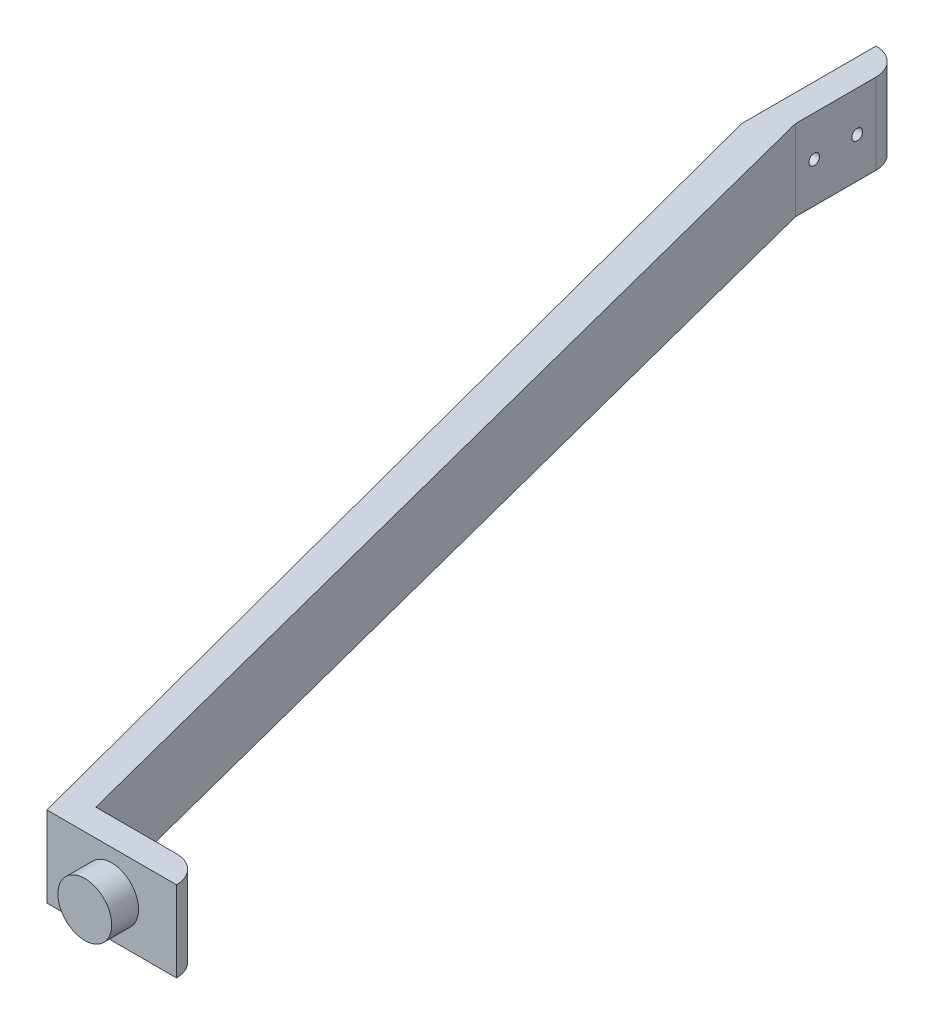
ISO-10303-21;
HEADER;
FILE_DESCRIPTION(('STEP AP214'),'2;1');
FILE_NAME('part.step','',(''),(''),'','','');
FILE_SCHEMA(('AUTOMOTIVE_DESIGN { 1 0 10303 214 1 1 1 1 }'));
ENDSEC;
DATA;
#1=APPLICATION_CONTEXT('core data for automotive mechanical design processes');
#2=APPLICATION_PROTOCOL_DEFINITION('international standard','automotive_design',2000,#1);
#3=PRODUCT_CONTEXT('',#1,'mechanical');
#4=PRODUCT('Part','Part','',(#3));
#5=PRODUCT_RELATED_PRODUCT_CATEGORY('part','',(#4));
#6=PRODUCT_DEFINITION_FORMATION('','',#4);
#7=PRODUCT_DEFINITION_CONTEXT('part definition',#1,'design');
#8=PRODUCT_DEFINITION('design','',#6,#7);
#9=PRODUCT_DEFINITION_SHAPE('','',#8);
#10=(LENGTH_UNIT() NAMED_UNIT(*) SI_UNIT(.MILLI.,.METRE.));
#11=(NAMED_UNIT(*) PLANE_ANGLE_UNIT() SI_UNIT($,.RADIAN.));
#12=(NAMED_UNIT(*) SI_UNIT($,.STERADIAN.) SOLID_ANGLE_UNIT());
#13=UNCERTAINTY_MEASURE_WITH_UNIT(LENGTH_MEASURE(1.E-05),#10,'distance_accuracy_value','');
#14=(GEOMETRIC_REPRESENTATION_CONTEXT(3) GLOBAL_UNCERTAINTY_ASSIGNED_CONTEXT((#13)) GLOBAL_UNIT_ASSIGNED_CONTEXT((#10,
#11,#12)) REPRESENTATION_CONTEXT('',''));
#15=CARTESIAN_POINT('',(0.,0.,0.));
#16=DIRECTION('',(0.,0.,1.));
#17=DIRECTION('',(1.,0.,0.));
#18=AXIS2_PLACEMENT_3D('',#15,#16,#17);
#19=CARTESIAN_POINT('',(70.,30.,200.));
#20=DIRECTION('',(0.,0.,-1.));
#21=DIRECTION('',(-1.,0.,0.));
#22=AXIS2_PLACEMENT_3D('',#19,#20,#21);
#23=PLANE('',#22);
#24=DIRECTION('',(0.,1.,0.));
#25=VECTOR('',#24,1.);
#26=CARTESIAN_POINT('',(21.7864152152697,0.,200.));
#27=LINE('',#26,#25);
#28=CARTESIAN_POINT('',(21.7864152152697,0.,200.));
#29=VERTEX_POINT('',#28);
#30=CARTESIAN_POINT('',(21.7864152152697,30.,200.));
#31=VERTEX_POINT('',#30);
#32=EDGE_CURVE('E168',#29,#31,#27,.T.);
#33=ORIENTED_EDGE('',*,*,#32,.F.);
#34=DIRECTION('',(1.,0.,0.));
#35=VECTOR('',#34,1.);
#36=CARTESIAN_POINT('',(70.,0.,200.));
#37=LINE('',#36,#35);
#38=CARTESIAN_POINT('',(70.,0.,200.));
#39=VERTEX_POINT('',#38);
#40=EDGE_CURVE('E177',#29,#39,#37,.T.);
#41=ORIENTED_EDGE('',*,*,#40,.T.);
#42=DIRECTION('',(0.,-1.,0.));
#43=VECTOR('',#42,1.);
#44=CARTESIAN_POINT('',(70.,30.,200.));
#45=LINE('',#44,#43);
#46=CARTESIAN_POINT('',(70.,30.,200.));
#47=VERTEX_POINT('',#46);
#48=EDGE_CURVE('E185',#47,#39,#45,.T.);
#49=ORIENTED_EDGE('',*,*,#48,.F.);
#50=DIRECTION('',(1.,0.,0.));
#51=VECTOR('',#50,1.);
#52=CARTESIAN_POINT('',(70.,30.,200.));
#53=LINE('',#52,#51);
#54=EDGE_CURVE('E176',#31,#47,#53,.T.);
#55=ORIENTED_EDGE('',*,*,#54,.F.);
#56=EDGE_LOOP('',(#33,#41,#49,#55));
#57=FACE_BOUND('',#56,.T.);
#58=CARTESIAN_POINT('',(45.8932076076348,15.,200.));
#59=DIRECTION('',(0.,0.,-1.));
#60=DIRECTION('',(-1.,0.,0.));
#61=AXIS2_PLACEMENT_3D('',#58,#59,#60);
#62=CIRCLE('',#61,10.);
#63=CARTESIAN_POINT('',(35.8932076076348,15.,200.));
#64=VERTEX_POINT('',#63);
#65=EDGE_CURVE('E188',#64,#64,#62,.F.);
#66=ORIENTED_EDGE('',*,*,#65,.F.);
#67=EDGE_LOOP('',(#66));
#68=FACE_BOUND('',#67,.T.);
#69=ADVANCED_FACE('F62',(#57,#68),#23,.F.);
#70=CARTESIAN_POINT('',(-70.,30.,-200.));
#71=DIRECTION('',(1.,0.,0.));
#72=DIRECTION('',(0.,0.,-1.));
#73=AXIS2_PLACEMENT_3D('',#70,#71,#72);
#74=PLANE('',#73);
#75=CARTESIAN_POINT('',(-70.,15.,-167.));
#76=DIRECTION('',(-1.,0.,0.));
#77=DIRECTION('',(0.,0.,1.));
#78=AXIS2_PLACEMENT_3D('',#75,#76,#77);
#79=CIRCLE('',#78,2.);
#80=CARTESIAN_POINT('',(-70.,15.,-165.));
#81=VERTEX_POINT('',#80);
#82=EDGE_CURVE('E195',#81,#81,#79,.T.);
#83=ORIENTED_EDGE('',*,*,#82,.F.);
#84=EDGE_LOOP('',(#83));
#85=FACE_BOUND('',#84,.T.);
#86=CARTESIAN_POINT('',(-70.,15.,-183.));
#87=DIRECTION('',(-1.,0.,0.));
#88=DIRECTION('',(0.,0.,1.));
#89=AXIS2_PLACEMENT_3D('',#86,#87,#88);
#90=CIRCLE('',#89,2.);
#91=CARTESIAN_POINT('',(-70.,15.,-181.));
#92=VERTEX_POINT('',#91);
#93=EDGE_CURVE('E191',#92,#92,#90,.T.);
#94=ORIENTED_EDGE('',*,*,#93,.F.);
#95=EDGE_LOOP('',(#94));
#96=FACE_BOUND('',#95,.T.);
#97=DIRECTION('',(0.,1.,0.));
#98=VECTOR('',#97,1.);
#99=CARTESIAN_POINT('',(-70.,0.,-150.));
#100=LINE('',#99,#98);
#101=CARTESIAN_POINT('',(-70.,0.,-150.));
#102=VERTEX_POINT('',#101);
#103=CARTESIAN_POINT('',(-70.,30.,-150.));
#104=VERTEX_POINT('',#103);
#105=EDGE_CURVE('E165',#102,#104,#100,.T.);
#106=ORIENTED_EDGE('',*,*,#105,.T.);
#107=DIRECTION('',(0.,0.,1.));
#108=VECTOR('',#107,1.);
#109=CARTESIAN_POINT('',(-70.,30.,-200.));
#110=LINE('',#109,#108);
#111=CARTESIAN_POINT('',(-70.,30.,-200.));
#112=VERTEX_POINT('',#111);
#113=EDGE_CURVE('E173',#112,#104,#110,.T.);
#114=ORIENTED_EDGE('',*,*,#113,.F.);
#115=DIRECTION('',(0.,-1.,0.));
#116=VECTOR('',#115,1.);
#117=CARTESIAN_POINT('',(-70.,30.,-200.));
#118=LINE('',#117,#116);
#119=CARTESIAN_POINT('',(-70.,0.,-200.));
#120=VERTEX_POINT('',#119);
#121=EDGE_CURVE('E179',#112,#120,#118,.T.);
#122=ORIENTED_EDGE('',*,*,#121,.T.);
#123=DIRECTION('',(0.,0.,1.));
#124=VECTOR('',#123,1.);
#125=CARTESIAN_POINT('',(-70.,0.,-200.));
#126=LINE('',#125,#124);
#127=EDGE_CURVE('E170',#120,#102,#126,.T.);
#128=ORIENTED_EDGE('',*,*,#127,.T.);
#129=EDGE_LOOP('',(#106,#114,#122,#128));
#130=FACE_BOUND('',#129,.T.);
#131=ADVANCED_FACE('F208',(#85,#96,#130),#74,.F.);
#132=CARTESIAN_POINT('',(0.,30.,0.));
#133=DIRECTION('',(0.,-1.,0.));
#134=DIRECTION('',(0.,0.,-1.));
#135=AXIS2_PLACEMENT_3D('',#132,#133,#134);
#136=PLANE('',#135);
#137=ORIENTED_EDGE('',*,*,#54,.T.);
#138=CARTESIAN_POINT('',(60.,30.,200.));
#139=DIRECTION('',(0.,-1.,0.));
#140=DIRECTION('',(0.,0.,-1.));
#141=AXIS2_PLACEMENT_3D('',#138,#139,#140);
#142=CIRCLE('',#141,10.);
#143=CARTESIAN_POINT('',(60.,30.,190.));
#144=VERTEX_POINT('',#143);
#145=EDGE_CURVE('E84',#47,#144,#142,.F.);
#146=ORIENTED_EDGE('',*,*,#145,.T.);
#147=DIRECTION('',(-1.,0.,0.));
#148=VECTOR('',#147,1.);
#149=CARTESIAN_POINT('',(0.,30.,190.));
#150=LINE('',#149,#148);
#151=CARTESIAN_POINT('',(30.,30.,190.));
#152=VERTEX_POINT('',#151);
#153=EDGE_CURVE('E136',#144,#152,#150,.T.);
#154=ORIENTED_EDGE('',*,*,#153,.T.);
#155=DIRECTION('',(0.249041039810619,0.,0.96849293259685));
#156=VECTOR('',#155,1.);
#157=CARTESIAN_POINT('',(-17.687595712098,30.,4.54823889739664));
#158=LINE('',#157,#156);
#159=CARTESIAN_POINT('',(-60.,30.,-160.));
#160=VERTEX_POINT('',#159);
#161=EDGE_CURVE('E157',#160,#152,#158,.T.);
#162=ORIENTED_EDGE('',*,*,#161,.F.);
#163=DIRECTION('',(0.,0.,1.));
#164=VECTOR('',#163,1.);
#165=CARTESIAN_POINT('',(-60.,30.,0.));
#166=LINE('',#165,#164);
#167=CARTESIAN_POINT('',(-60.,30.,-190.));
#168=VERTEX_POINT('',#167);
#169=EDGE_CURVE('E142',#168,#160,#166,.T.);
#170=ORIENTED_EDGE('',*,*,#169,.F.);
#171=CARTESIAN_POINT('',(-70.,30.,-190.));
#172=DIRECTION('',(0.,-1.,0.));
#173=DIRECTION('',(0.,0.,-1.));
#174=AXIS2_PLACEMENT_3D('',#171,#172,#173);
#175=CIRCLE('',#174,10.);
#176=EDGE_CURVE('E200',#168,#112,#175,.F.);
#177=ORIENTED_EDGE('',*,*,#176,.T.);
#178=ORIENTED_EDGE('',*,*,#113,.T.);
#179=DIRECTION('',(0.253669082710904,0.,0.967291060889435));
#180=VECTOR('',#179,1.);
#181=CARTESIAN_POINT('',(-28.6898643338206,30.,7.52382800061091));
#182=LINE('',#181,#180);
#183=EDGE_CURVE('E161',#104,#31,#182,.T.);
#184=ORIENTED_EDGE('',*,*,#183,.T.);
#185=EDGE_LOOP('',(#137,#146,#154,#162,#170,#177,#178,#184));
#186=FACE_BOUND('',#185,.T.);
#187=ADVANCED_FACE('F204',(#186),#136,.F.);
#188=CARTESIAN_POINT('',(0.,0.,0.));
#189=DIRECTION('',(0.,-1.,0.));
#190=DIRECTION('',(0.,0.,-1.));
#191=AXIS2_PLACEMENT_3D('',#188,#189,#190);
#192=PLANE('',#191);
#193=DIRECTION('',(-1.,0.,0.));
#194=VECTOR('',#193,1.);
#195=CARTESIAN_POINT('',(0.,0.,190.));
#196=LINE('',#195,#194);
#197=CARTESIAN_POINT('',(60.,0.,190.));
#198=VERTEX_POINT('',#197);
#199=CARTESIAN_POINT('',(30.,0.,190.));
#200=VERTEX_POINT('',#199);
#201=EDGE_CURVE('E147',#198,#200,#196,.T.);
#202=ORIENTED_EDGE('',*,*,#201,.F.);
#203=CARTESIAN_POINT('',(60.,0.,200.));
#204=DIRECTION('',(0.,-1.,0.));
#205=DIRECTION('',(0.,0.,-1.));
#206=AXIS2_PLACEMENT_3D('',#203,#204,#205);
#207=CIRCLE('',#206,10.);
#208=EDGE_CURVE('E12',#198,#39,#207,.T.);
#209=ORIENTED_EDGE('',*,*,#208,.T.);
#210=ORIENTED_EDGE('',*,*,#40,.F.);
#211=DIRECTION('',(0.253669082710904,0.,0.967291060889435));
#212=VECTOR('',#211,1.);
#213=CARTESIAN_POINT('',(-28.6898643338206,0.,7.52382800061091));
#214=LINE('',#213,#212);
#215=EDGE_CURVE('E163',#102,#29,#214,.T.);
#216=ORIENTED_EDGE('',*,*,#215,.F.);
#217=ORIENTED_EDGE('',*,*,#127,.F.);
#218=CARTESIAN_POINT('',(-70.,0.,-190.));
#219=DIRECTION('',(0.,-1.,0.));
#220=DIRECTION('',(0.,0.,-1.));
#221=AXIS2_PLACEMENT_3D('',#218,#219,#220);
#222=CIRCLE('',#221,10.);
#223=CARTESIAN_POINT('',(-60.,0.,-190.));
#224=VERTEX_POINT('',#223);
#225=EDGE_CURVE('E132',#120,#224,#222,.T.);
#226=ORIENTED_EDGE('',*,*,#225,.T.);
#227=DIRECTION('',(0.,0.,1.));
#228=VECTOR('',#227,1.);
#229=CARTESIAN_POINT('',(-60.,0.,0.));
#230=LINE('',#229,#228);
#231=CARTESIAN_POINT('',(-60.,0.,-160.));
#232=VERTEX_POINT('',#231);
#233=EDGE_CURVE('E125',#224,#232,#230,.T.);
#234=ORIENTED_EDGE('',*,*,#233,.T.);
#235=DIRECTION('',(0.249041039810619,0.,0.96849293259685));
#236=VECTOR('',#235,1.);
#237=CARTESIAN_POINT('',(-17.687595712098,0.,4.54823889739664));
#238=LINE('',#237,#236);
#239=EDGE_CURVE('E129',#232,#200,#238,.T.);
#240=ORIENTED_EDGE('',*,*,#239,.T.);
#241=EDGE_LOOP('',(#202,#209,#210,#216,#217,#226,#234,#240));
#242=FACE_BOUND('',#241,.T.);
#243=ADVANCED_FACE('F127',(#242),#192,.T.);
#244=CARTESIAN_POINT('',(-28.6898643338206,0.,7.52382800061091));
#245=DIRECTION('',(-0.967291060889435,0.,0.253669082710904));
#246=DIRECTION('',(0.253669082710904,0.,0.967291060889435));
#247=AXIS2_PLACEMENT_3D('',#244,#245,#246);
#248=PLANE('',#247);
#249=ORIENTED_EDGE('',*,*,#183,.F.);
#250=ORIENTED_EDGE('',*,*,#105,.F.);
#251=ORIENTED_EDGE('',*,*,#215,.T.);
#252=ORIENTED_EDGE('',*,*,#32,.T.);
#253=EDGE_LOOP('',(#249,#250,#251,#252));
#254=FACE_BOUND('',#253,.T.);
#255=ADVANCED_FACE('F233',(#254),#248,.T.);
#256=CARTESIAN_POINT('',(-60.,0.,0.));
#257=DIRECTION('',(-1.,0.,0.));
#258=DIRECTION('',(0.,0.,1.));
#259=AXIS2_PLACEMENT_3D('',#256,#257,#258);
#260=PLANE('',#259);
#261=CARTESIAN_POINT('',(-60.,15.,-167.));
#262=DIRECTION('',(-1.,0.,0.));
#263=DIRECTION('',(0.,0.,1.));
#264=AXIS2_PLACEMENT_3D('',#261,#262,#263);
#265=CIRCLE('',#264,2.);
#266=CARTESIAN_POINT('',(-60.,15.,-165.));
#267=VERTEX_POINT('',#266);
#268=EDGE_CURVE('E192',#267,#267,#265,.T.);
#269=ORIENTED_EDGE('',*,*,#268,.T.);
#270=EDGE_LOOP('',(#269));
#271=FACE_BOUND('',#270,.T.);
#272=CARTESIAN_POINT('',(-60.,15.,-183.));
#273=DIRECTION('',(-1.,0.,0.));
#274=DIRECTION('',(0.,0.,1.));
#275=AXIS2_PLACEMENT_3D('',#272,#273,#274);
#276=CIRCLE('',#275,2.);
#277=CARTESIAN_POINT('',(-60.,15.,-181.));
#278=VERTEX_POINT('',#277);
#279=EDGE_CURVE('E158',#278,#278,#276,.T.);
#280=ORIENTED_EDGE('',*,*,#279,.T.);
#281=EDGE_LOOP('',(#280));
#282=FACE_BOUND('',#281,.T.);
#283=ORIENTED_EDGE('',*,*,#233,.F.);
#284=DIRECTION('',(0.,1.,0.));
#285=VECTOR('',#284,1.);
#286=CARTESIAN_POINT('',(-60.,0.,-190.));
#287=LINE('',#286,#285);
#288=EDGE_CURVE('E198',#224,#168,#287,.T.);
#289=ORIENTED_EDGE('',*,*,#288,.T.);
#290=ORIENTED_EDGE('',*,*,#169,.T.);
#291=DIRECTION('',(0.,1.,0.));
#292=VECTOR('',#291,1.);
#293=CARTESIAN_POINT('',(-60.,0.,-160.));
#294=LINE('',#293,#292);
#295=EDGE_CURVE('E139',#232,#160,#294,.T.);
#296=ORIENTED_EDGE('',*,*,#295,.F.);
#297=EDGE_LOOP('',(#283,#289,#290,#296));
#298=FACE_BOUND('',#297,.T.);
#299=ADVANCED_FACE('F140',(#271,#282,#298),#260,.F.);
#300=CARTESIAN_POINT('',(0.,0.,190.));
#301=DIRECTION('',(0.,0.,-1.));
#302=DIRECTION('',(-1.,0.,0.));
#303=AXIS2_PLACEMENT_3D('',#300,#301,#302);
#304=PLANE('',#303);
#305=ORIENTED_EDGE('',*,*,#153,.F.);
#306=DIRECTION('',(0.,1.,0.));
#307=VECTOR('',#306,1.);
#308=CARTESIAN_POINT('',(60.,0.,190.));
#309=LINE('',#308,#307);
#310=EDGE_CURVE('E70',#144,#198,#309,.F.);
#311=ORIENTED_EDGE('',*,*,#310,.T.);
#312=ORIENTED_EDGE('',*,*,#201,.T.);
#313=DIRECTION('',(0.,1.,0.));
#314=VECTOR('',#313,1.);
#315=CARTESIAN_POINT('',(30.,0.,190.));
#316=LINE('',#315,#314);
#317=EDGE_CURVE('E146',#200,#152,#316,.T.);
#318=ORIENTED_EDGE('',*,*,#317,.T.);
#319=EDGE_LOOP('',(#305,#311,#312,#318));
#320=FACE_BOUND('',#319,.T.);
#321=ADVANCED_FACE('F241',(#320),#304,.T.);
#322=CARTESIAN_POINT('',(-17.687595712098,0.,4.54823889739664));
#323=DIRECTION('',(-0.96849293259685,0.,0.249041039810619));
#324=DIRECTION('',(0.249041039810619,0.,0.96849293259685));
#325=AXIS2_PLACEMENT_3D('',#322,#323,#324);
#326=PLANE('',#325);
#327=ORIENTED_EDGE('',*,*,#161,.T.);
#328=ORIENTED_EDGE('',*,*,#317,.F.);
#329=ORIENTED_EDGE('',*,*,#239,.F.);
#330=ORIENTED_EDGE('',*,*,#295,.T.);
#331=EDGE_LOOP('',(#327,#328,#329,#330));
#332=FACE_BOUND('',#331,.T.);
#333=ADVANCED_FACE('F150',(#332),#326,.F.);
#334=CARTESIAN_POINT('',(70.,15.,-183.));
#335=DIRECTION('',(-1.,0.,0.));
#336=DIRECTION('',(0.,0.,1.));
#337=AXIS2_PLACEMENT_3D('',#334,#335,#336);
#338=CYLINDRICAL_SURFACE('',#337,2.);
#339=ORIENTED_EDGE('',*,*,#93,.T.);
#340=EDGE_LOOP('',(#339));
#341=FACE_BOUND('',#340,.T.);
#342=ORIENTED_EDGE('',*,*,#279,.F.);
#343=EDGE_LOOP('',(#342));
#344=FACE_BOUND('',#343,.T.);
#345=ADVANCED_FACE('F245',(#341,#344),#338,.F.);
#346=CARTESIAN_POINT('',(70.,15.,-167.));
#347=DIRECTION('',(-1.,0.,0.));
#348=DIRECTION('',(0.,0.,1.));
#349=AXIS2_PLACEMENT_3D('',#346,#347,#348);
#350=CYLINDRICAL_SURFACE('',#349,2.);
#351=ORIENTED_EDGE('',*,*,#82,.T.);
#352=EDGE_LOOP('',(#351));
#353=FACE_BOUND('',#352,.T.);
#354=ORIENTED_EDGE('',*,*,#268,.F.);
#355=EDGE_LOOP('',(#354));
#356=FACE_BOUND('',#355,.T.);
#357=ADVANCED_FACE('F250',(#353,#356),#350,.F.);
#358=CARTESIAN_POINT('',(45.8932076076348,15.,210.));
#359=DIRECTION('',(0.,0.,-1.));
#360=DIRECTION('',(-1.,0.,0.));
#361=AXIS2_PLACEMENT_3D('',#358,#359,#360);
#362=CYLINDRICAL_SURFACE('',#361,10.);
#363=CARTESIAN_POINT('',(45.8932076076348,15.,210.));
#364=DIRECTION('',(0.,0.,1.));
#365=DIRECTION('',(1.,0.,0.));
#366=AXIS2_PLACEMENT_3D('',#363,#364,#365);
#367=CIRCLE('',#366,10.);
#368=CARTESIAN_POINT('',(55.8932076076348,15.,210.));
#369=VERTEX_POINT('',#368);
#370=EDGE_CURVE('E262',#369,#369,#367,.T.);
#371=ORIENTED_EDGE('',*,*,#370,.F.);
#372=EDGE_LOOP('',(#371));
#373=FACE_BOUND('',#372,.T.);
#374=ORIENTED_EDGE('',*,*,#65,.T.);
#375=EDGE_LOOP('',(#374));
#376=FACE_BOUND('',#375,.T.);
#377=ADVANCED_FACE('F217',(#373,#376),#362,.T.);
#378=CARTESIAN_POINT('',(0.,0.,210.));
#379=DIRECTION('',(0.,0.,1.));
#380=DIRECTION('',(1.,0.,0.));
#381=AXIS2_PLACEMENT_3D('',#378,#379,#380);
#382=PLANE('',#381);
#383=ORIENTED_EDGE('',*,*,#370,.T.);
#384=EDGE_LOOP('',(#383));
#385=FACE_BOUND('',#384,.T.);
#386=ADVANCED_FACE('F211',(#385),#382,.T.);
#387=CARTESIAN_POINT('',(-70.,0.,-190.));
#388=DIRECTION('',(0.,1.,0.));
#389=DIRECTION('',(0.,0.,1.));
#390=AXIS2_PLACEMENT_3D('',#387,#388,#389);
#391=CYLINDRICAL_SURFACE('',#390,10.);
#392=ORIENTED_EDGE('',*,*,#225,.F.);
#393=ORIENTED_EDGE('',*,*,#121,.F.);
#394=ORIENTED_EDGE('',*,*,#176,.F.);
#395=ORIENTED_EDGE('',*,*,#288,.F.);
#396=EDGE_LOOP('',(#392,#393,#394,#395));
#397=FACE_BOUND('',#396,.T.);
#398=ADVANCED_FACE('F209',(#397),#391,.T.);
#399=CARTESIAN_POINT('',(60.,30.,200.));
#400=DIRECTION('',(0.,-1.,0.));
#401=DIRECTION('',(0.,0.,-1.));
#402=AXIS2_PLACEMENT_3D('',#399,#400,#401);
#403=CYLINDRICAL_SURFACE('',#402,10.);
#404=ORIENTED_EDGE('',*,*,#208,.F.);
#405=ORIENTED_EDGE('',*,*,#310,.F.);
#406=ORIENTED_EDGE('',*,*,#145,.F.);
#407=ORIENTED_EDGE('',*,*,#48,.T.);
#408=EDGE_LOOP('',(#404,#405,#406,#407));
#409=FACE_BOUND('',#408,.T.);
#410=ADVANCED_FACE('F64',(#409),#403,.T.);
#411=CLOSED_SHELL('',(#69,#131,#187,#243,#255,#299,#321,#333,#345,#357,#377,#386,#398,#410));
#412=MANIFOLD_SOLID_BREP('B2',#411);
#413=ADVANCED_BREP_SHAPE_REPRESENTATION('',(#18,#412),#14);
#414=SHAPE_DEFINITION_REPRESENTATION(#9,#413);
ENDSEC;
END-ISO-10303-21;
